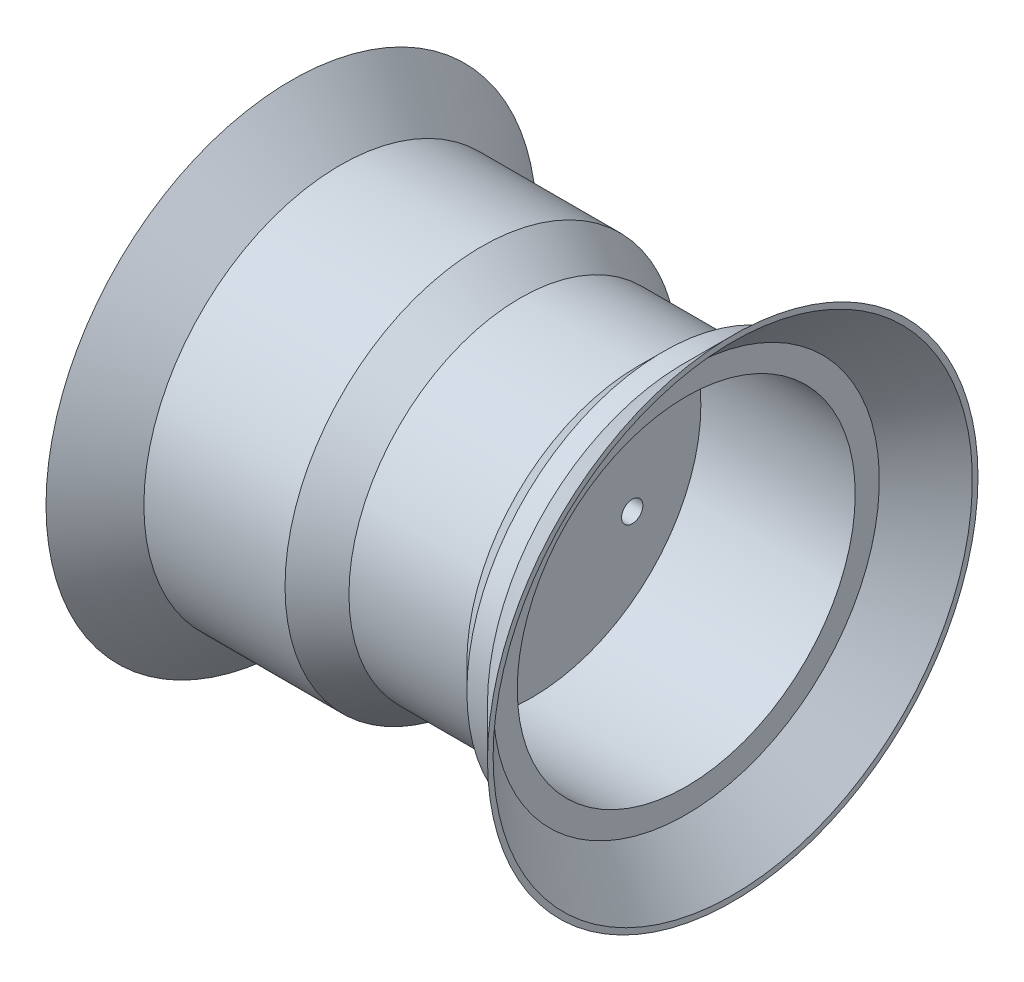
ISO-10303-21;
HEADER;
FILE_DESCRIPTION(('STEP AP214'),'2;1');
FILE_NAME('part.step','',(''),(''),'','','');
FILE_SCHEMA(('AUTOMOTIVE_DESIGN { 1 0 10303 214 1 1 1 1 }'));
ENDSEC;
DATA;
#1=APPLICATION_CONTEXT('core data for automotive mechanical design processes');
#2=APPLICATION_PROTOCOL_DEFINITION('international standard','automotive_design',2000,#1);
#3=PRODUCT_CONTEXT('',#1,'mechanical');
#4=PRODUCT('Part','Part','',(#3));
#5=PRODUCT_RELATED_PRODUCT_CATEGORY('part','',(#4));
#6=PRODUCT_DEFINITION_FORMATION('','',#4);
#7=PRODUCT_DEFINITION_CONTEXT('part definition',#1,'design');
#8=PRODUCT_DEFINITION('design','',#6,#7);
#9=PRODUCT_DEFINITION_SHAPE('','',#8);
#10=(LENGTH_UNIT() NAMED_UNIT(*) SI_UNIT(.MILLI.,.METRE.));
#11=(NAMED_UNIT(*) PLANE_ANGLE_UNIT() SI_UNIT($,.RADIAN.));
#12=(NAMED_UNIT(*) SI_UNIT($,.STERADIAN.) SOLID_ANGLE_UNIT());
#13=UNCERTAINTY_MEASURE_WITH_UNIT(LENGTH_MEASURE(1.E-05),#10,'distance_accuracy_value','');
#14=(GEOMETRIC_REPRESENTATION_CONTEXT(3) GLOBAL_UNCERTAINTY_ASSIGNED_CONTEXT((#13)) GLOBAL_UNIT_ASSIGNED_CONTEXT((#10,
#11,#12)) REPRESENTATION_CONTEXT('',''));
#15=CARTESIAN_POINT('',(0.,0.,0.));
#16=DIRECTION('',(0.,0.,1.));
#17=DIRECTION('',(1.,0.,0.));
#18=AXIS2_PLACEMENT_3D('',#15,#16,#17);
#19=CARTESIAN_POINT('',(48.,0.,0.));
#20=DIRECTION('',(-1.,0.,0.));
#21=DIRECTION('',(0.,0.,1.));
#22=AXIS2_PLACEMENT_3D('',#19,#20,#21);
#23=PLANE('',#22);
#24=CARTESIAN_POINT('',(48.,0.,0.));
#25=DIRECTION('',(-1.,0.,0.));
#26=DIRECTION('',(0.,0.,1.));
#27=AXIS2_PLACEMENT_3D('',#24,#25,#26);
#28=CIRCLE('',#27,50.);
#29=CARTESIAN_POINT('',(48.,0.,50.));
#30=VERTEX_POINT('',#29);
#31=EDGE_CURVE('E93',#30,#30,#28,.T.);
#32=ORIENTED_EDGE('',*,*,#31,.T.);
#33=EDGE_LOOP('',(#32));
#34=FACE_BOUND('',#33,.T.);
#35=CARTESIAN_POINT('',(48.,0.,0.));
#36=DIRECTION('',(-1.,0.,0.));
#37=DIRECTION('',(0.,0.,1.));
#38=AXIS2_PLACEMENT_3D('',#35,#36,#37);
#39=CIRCLE('',#38,48.9241631281988);
#40=CARTESIAN_POINT('',(48.,0.,48.9241631281988));
#41=VERTEX_POINT('',#40);
#42=EDGE_CURVE('E57',#41,#41,#39,.F.);
#43=ORIENTED_EDGE('',*,*,#42,.T.);
#44=EDGE_LOOP('',(#43));
#45=FACE_BOUND('',#44,.T.);
#46=ADVANCED_FACE('F31',(#34,#45),#23,.T.);
#47=CARTESIAN_POINT('',(0.,0.,0.));
#48=DIRECTION('',(1.,0.,0.));
#49=DIRECTION('',(0.,0.,-1.));
#50=AXIS2_PLACEMENT_3D('',#47,#48,#49);
#51=PLANE('',#50);
#52=CARTESIAN_POINT('',(0.,0.,0.));
#53=DIRECTION('',(1.,0.,0.));
#54=DIRECTION('',(0.,0.,-1.));
#55=AXIS2_PLACEMENT_3D('',#52,#53,#54);
#56=CIRCLE('',#55,62.041253289042);
#57=CARTESIAN_POINT('',(0.,0.,-62.041253289042));
#58=VERTEX_POINT('',#57);
#59=EDGE_CURVE('E51',#58,#58,#56,.F.);
#60=ORIENTED_EDGE('',*,*,#59,.F.);
#61=EDGE_LOOP('',(#60));
#62=FACE_BOUND('',#61,.T.);
#63=CARTESIAN_POINT('',(0.,0.,0.));
#64=DIRECTION('',(-1.,0.,0.));
#65=DIRECTION('',(0.,0.,1.));
#66=AXIS2_PLACEMENT_3D('',#63,#64,#65);
#67=CIRCLE('',#66,63.5);
#68=CARTESIAN_POINT('',(0.,0.,63.5));
#69=VERTEX_POINT('',#68);
#70=EDGE_CURVE('E10',#69,#69,#67,.T.);
#71=ORIENTED_EDGE('',*,*,#70,.T.);
#72=EDGE_LOOP('',(#71));
#73=FACE_BOUND('',#72,.T.);
#74=ADVANCED_FACE('F33',(#62,#73),#51,.F.);
#75=CARTESIAN_POINT('',(12.6713535188629,0.,0.));
#76=DIRECTION('',(-1.,0.,0.));
#77=DIRECTION('',(0.,0.,1.));
#78=AXIS2_PLACEMENT_3D('',#75,#76,#77);
#79=CONICAL_SURFACE('',#78,50.8286464811371,0.785398163397449);
#80=ORIENTED_EDGE('',*,*,#70,.F.);
#81=EDGE_LOOP('',(#80));
#82=FACE_BOUND('',#81,.T.);
#83=CARTESIAN_POINT('',(12.6713535188629,0.,0.));
#84=DIRECTION('',(-1.,0.,0.));
#85=DIRECTION('',(0.,0.,1.));
#86=AXIS2_PLACEMENT_3D('',#83,#84,#85);
#87=CIRCLE('',#86,50.8286464811371);
#88=CARTESIAN_POINT('',(12.6713535188629,0.,50.8286464811371));
#89=VERTEX_POINT('',#88);
#90=EDGE_CURVE('E39',#89,#89,#87,.T.);
#91=ORIENTED_EDGE('',*,*,#90,.T.);
#92=EDGE_LOOP('',(#91));
#93=FACE_BOUND('',#92,.T.);
#94=ADVANCED_FACE('F164',(#82,#93),#79,.T.);
#95=CARTESIAN_POINT('',(0.,0.,0.));
#96=DIRECTION('',(-1.,0.,0.));
#97=DIRECTION('',(0.,0.,1.));
#98=AXIS2_PLACEMENT_3D('',#95,#96,#97);
#99=CYLINDRICAL_SURFACE('',#98,50.8286464811371);
#100=ORIENTED_EDGE('',*,*,#90,.F.);
#101=EDGE_LOOP('',(#100));
#102=FACE_BOUND('',#101,.T.);
#103=CARTESIAN_POINT('',(49.2145860056369,0.,0.));
#104=DIRECTION('',(-1.,0.,0.));
#105=DIRECTION('',(0.,0.,1.));
#106=AXIS2_PLACEMENT_3D('',#103,#104,#105);
#107=CIRCLE('',#106,50.8286464811371);
#108=CARTESIAN_POINT('',(49.2145860056369,0.,50.8286464811371));
#109=VERTEX_POINT('',#108);
#110=EDGE_CURVE('E44',#109,#109,#107,.T.);
#111=ORIENTED_EDGE('',*,*,#110,.T.);
#112=EDGE_LOOP('',(#111));
#113=FACE_BOUND('',#112,.T.);
#114=ADVANCED_FACE('F113',(#102,#113),#99,.T.);
#115=CARTESIAN_POINT('',(59.2702116618242,0.,0.));
#116=DIRECTION('',(-1.,0.,0.));
#117=DIRECTION('',(0.,0.,1.));
#118=AXIS2_PLACEMENT_3D('',#115,#116,#117);
#119=CONICAL_SURFACE('',#118,44.337039427469,0.573254453729873);
#120=ORIENTED_EDGE('',*,*,#110,.F.);
#121=EDGE_LOOP('',(#120));
#122=FACE_BOUND('',#121,.T.);
#123=CARTESIAN_POINT('',(59.2702116618242,0.,0.));
#124=DIRECTION('',(-1.,0.,0.));
#125=DIRECTION('',(0.,0.,1.));
#126=AXIS2_PLACEMENT_3D('',#123,#124,#125);
#127=CIRCLE('',#126,44.337039427469);
#128=CARTESIAN_POINT('',(59.2702116618242,0.,44.337039427469));
#129=VERTEX_POINT('',#128);
#130=EDGE_CURVE('E108',#129,#129,#127,.T.);
#131=ORIENTED_EDGE('',*,*,#130,.T.);
#132=EDGE_LOOP('',(#131));
#133=FACE_BOUND('',#132,.T.);
#134=ADVANCED_FACE('F115',(#122,#133),#119,.T.);
#135=CARTESIAN_POINT('',(0.,0.,0.));
#136=DIRECTION('',(-1.,0.,0.));
#137=DIRECTION('',(0.,0.,1.));
#138=AXIS2_PLACEMENT_3D('',#135,#136,#137);
#139=CYLINDRICAL_SURFACE('',#138,44.337039427469);
#140=ORIENTED_EDGE('',*,*,#130,.F.);
#141=EDGE_LOOP('',(#140));
#142=FACE_BOUND('',#141,.T.);
#143=CARTESIAN_POINT('',(89.8029204149404,0.,0.));
#144=DIRECTION('',(-1.,0.,0.));
#145=DIRECTION('',(0.,0.,1.));
#146=AXIS2_PLACEMENT_3D('',#143,#144,#145);
#147=CIRCLE('',#146,44.337039427469);
#148=CARTESIAN_POINT('',(89.8029204149404,0.,44.337039427469));
#149=VERTEX_POINT('',#148);
#150=EDGE_CURVE('E105',#149,#149,#147,.T.);
#151=ORIENTED_EDGE('',*,*,#150,.T.);
#152=EDGE_LOOP('',(#151));
#153=FACE_BOUND('',#152,.T.);
#154=ADVANCED_FACE('F118',(#142,#153),#139,.T.);
#155=CARTESIAN_POINT('',(96.2945274686083,0.,0.));
#156=DIRECTION('',(1.,0.,0.));
#157=DIRECTION('',(0.,0.,-1.));
#158=AXIS2_PLACEMENT_3D('',#155,#156,#157);
#159=CONICAL_SURFACE('',#158,50.8286464811371,0.785398163397461);
#160=ORIENTED_EDGE('',*,*,#150,.F.);
#161=EDGE_LOOP('',(#160));
#162=FACE_BOUND('',#161,.T.);
#163=CARTESIAN_POINT('',(96.2945274686083,0.,0.));
#164=DIRECTION('',(-1.,0.,0.));
#165=DIRECTION('',(0.,0.,1.));
#166=AXIS2_PLACEMENT_3D('',#163,#164,#165);
#167=CIRCLE('',#166,50.8286464811371);
#168=CARTESIAN_POINT('',(96.2945274686083,0.,50.8286464811371));
#169=VERTEX_POINT('',#168);
#170=EDGE_CURVE('E102',#169,#169,#167,.T.);
#171=ORIENTED_EDGE('',*,*,#170,.T.);
#172=EDGE_LOOP('',(#171));
#173=FACE_BOUND('',#172,.T.);
#174=ADVANCED_FACE('F124',(#162,#173),#159,.T.);
#175=CARTESIAN_POINT('',(0.,0.,0.));
#176=DIRECTION('',(-1.,0.,0.));
#177=DIRECTION('',(0.,0.,1.));
#178=AXIS2_PLACEMENT_3D('',#175,#176,#177);
#179=CYLINDRICAL_SURFACE('',#178,50.8286464811371);
#180=ORIENTED_EDGE('',*,*,#170,.F.);
#181=EDGE_LOOP('',(#180));
#182=FACE_BOUND('',#181,.T.);
#183=CARTESIAN_POINT('',(101.628646481137,0.,0.));
#184=DIRECTION('',(-1.,0.,0.));
#185=DIRECTION('',(0.,0.,1.));
#186=AXIS2_PLACEMENT_3D('',#183,#184,#185);
#187=CIRCLE('',#186,50.8286464811371);
#188=CARTESIAN_POINT('',(101.628646481137,0.,50.8286464811371));
#189=VERTEX_POINT('',#188);
#190=EDGE_CURVE('E99',#189,#189,#187,.T.);
#191=ORIENTED_EDGE('',*,*,#190,.T.);
#192=EDGE_LOOP('',(#191));
#193=FACE_BOUND('',#192,.T.);
#194=ADVANCED_FACE('F130',(#182,#193),#179,.T.);
#195=CARTESIAN_POINT('',(114.3,0.,0.));
#196=DIRECTION('',(1.,0.,0.));
#197=DIRECTION('',(0.,0.,-1.));
#198=AXIS2_PLACEMENT_3D('',#195,#196,#197);
#199=CONICAL_SURFACE('',#198,63.5,0.785398163397448);
#200=ORIENTED_EDGE('',*,*,#190,.F.);
#201=EDGE_LOOP('',(#200));
#202=FACE_BOUND('',#201,.T.);
#203=CARTESIAN_POINT('',(114.3,0.,0.));
#204=DIRECTION('',(-1.,0.,0.));
#205=DIRECTION('',(0.,0.,1.));
#206=AXIS2_PLACEMENT_3D('',#203,#204,#205);
#207=CIRCLE('',#206,63.5);
#208=CARTESIAN_POINT('',(114.3,0.,63.5));
#209=VERTEX_POINT('',#208);
#210=EDGE_CURVE('E96',#209,#209,#207,.T.);
#211=ORIENTED_EDGE('',*,*,#210,.T.);
#212=EDGE_LOOP('',(#211));
#213=FACE_BOUND('',#212,.T.);
#214=ADVANCED_FACE('F136',(#202,#213),#199,.T.);
#215=CARTESIAN_POINT('',(114.3,63.5,0.));
#216=DIRECTION('',(-1.,0.,0.));
#217=DIRECTION('',(0.,0.,1.));
#218=AXIS2_PLACEMENT_3D('',#215,#216,#217);
#219=PLANE('',#218);
#220=CARTESIAN_POINT('',(114.3,0.,0.));
#221=DIRECTION('',(-1.,0.,0.));
#222=DIRECTION('',(0.,0.,1.));
#223=AXIS2_PLACEMENT_3D('',#220,#221,#222);
#224=CIRCLE('',#223,62.041253289042);
#225=CARTESIAN_POINT('',(114.3,0.,62.041253289042));
#226=VERTEX_POINT('',#225);
#227=EDGE_CURVE('E53',#226,#226,#224,.F.);
#228=ORIENTED_EDGE('',*,*,#227,.F.);
#229=EDGE_LOOP('',(#228));
#230=FACE_BOUND('',#229,.T.);
#231=ORIENTED_EDGE('',*,*,#210,.F.);
#232=EDGE_LOOP('',(#231));
#233=FACE_BOUND('',#232,.T.);
#234=ADVANCED_FACE('F142',(#230,#233),#219,.F.);
#235=CARTESIAN_POINT('',(114.577777226452,0.,0.));
#236=DIRECTION('',(1.,0.,0.));
#237=DIRECTION('',(0.,0.,-1.));
#238=AXIS2_PLACEMENT_3D('',#235,#236,#237);
#239=CONICAL_SURFACE('',#238,62.3190305154939,0.785398163397442);
#240=CARTESIAN_POINT('',(102.258746710958,0.,0.));
#241=DIRECTION('',(-1.,0.,0.));
#242=DIRECTION('',(0.,0.,1.));
#243=AXIS2_PLACEMENT_3D('',#240,#241,#242);
#244=CIRCLE('',#243,50.);
#245=CARTESIAN_POINT('',(102.258746710958,0.,50.));
#246=VERTEX_POINT('',#245);
#247=EDGE_CURVE('E60',#246,#246,#244,.T.);
#248=ORIENTED_EDGE('',*,*,#247,.T.);
#249=EDGE_LOOP('',(#248));
#250=FACE_BOUND('',#249,.T.);
#251=ORIENTED_EDGE('',*,*,#227,.T.);
#252=EDGE_LOOP('',(#251));
#253=FACE_BOUND('',#252,.T.);
#254=ADVANCED_FACE('F147',(#250,#253),#239,.F.);
#255=CARTESIAN_POINT('',(102.258746710958,50.,0.));
#256=DIRECTION('',(1.,0.,0.));
#257=DIRECTION('',(0.,0.,-1.));
#258=AXIS2_PLACEMENT_3D('',#255,#256,#257);
#259=PLANE('',#258);
#260=ORIENTED_EDGE('',*,*,#247,.F.);
#261=EDGE_LOOP('',(#260));
#262=FACE_BOUND('',#261,.T.);
#263=CARTESIAN_POINT('',(102.258746710958,0.,0.));
#264=DIRECTION('',(1.,0.,0.));
#265=DIRECTION('',(0.,0.,-1.));
#266=AXIS2_PLACEMENT_3D('',#263,#264,#265);
#267=CIRCLE('',#266,43.75);
#268=CARTESIAN_POINT('',(102.258746710958,0.,-43.75));
#269=VERTEX_POINT('',#268);
#270=EDGE_CURVE('E48',#269,#269,#267,.F.);
#271=ORIENTED_EDGE('',*,*,#270,.T.);
#272=EDGE_LOOP('',(#271));
#273=FACE_BOUND('',#272,.T.);
#274=ADVANCED_FACE('F153',(#262,#273),#259,.T.);
#275=CARTESIAN_POINT('',(12.0412532890421,0.,0.));
#276=DIRECTION('',(-1.,0.,0.));
#277=DIRECTION('',(0.,0.,1.));
#278=AXIS2_PLACEMENT_3D('',#275,#276,#277);
#279=CONICAL_SURFACE('',#278,50.,0.785398163397443);
#280=CARTESIAN_POINT('',(12.0412532890421,0.,0.));
#281=DIRECTION('',(-1.,0.,0.));
#282=DIRECTION('',(0.,0.,1.));
#283=AXIS2_PLACEMENT_3D('',#280,#281,#282);
#284=CIRCLE('',#283,50.);
#285=CARTESIAN_POINT('',(12.0412532890421,0.,50.));
#286=VERTEX_POINT('',#285);
#287=EDGE_CURVE('E52',#286,#286,#284,.T.);
#288=ORIENTED_EDGE('',*,*,#287,.F.);
#289=EDGE_LOOP('',(#288));
#290=FACE_BOUND('',#289,.T.);
#291=ORIENTED_EDGE('',*,*,#59,.T.);
#292=EDGE_LOOP('',(#291));
#293=FACE_BOUND('',#292,.T.);
#294=ADVANCED_FACE('F187',(#290,#293),#279,.F.);
#295=CARTESIAN_POINT('',(62.3,0.,0.));
#296=DIRECTION('',(1.,0.,0.));
#297=DIRECTION('',(0.,0.,-1.));
#298=AXIS2_PLACEMENT_3D('',#295,#296,#297);
#299=PLANE('',#298);
#300=CARTESIAN_POINT('',(62.3,0.,0.));
#301=DIRECTION('',(1.,0.,0.));
#302=DIRECTION('',(0.,0.,-1.));
#303=AXIS2_PLACEMENT_3D('',#300,#301,#302);
#304=CIRCLE('',#303,11.625);
#305=CARTESIAN_POINT('',(62.3,0.,-11.625));
#306=VERTEX_POINT('',#305);
#307=EDGE_CURVE('E69',#306,#306,#304,.T.);
#308=ORIENTED_EDGE('',*,*,#307,.F.);
#309=EDGE_LOOP('',(#308));
#310=FACE_BOUND('',#309,.T.);
#311=CARTESIAN_POINT('',(62.3,-15.0000000000011,25.9807621135312));
#312=DIRECTION('',(1.,0.,0.));
#313=DIRECTION('',(0.,0.,-1.));
#314=AXIS2_PLACEMENT_3D('',#311,#312,#313);
#315=CIRCLE('',#314,2.75000000000243);
#316=CARTESIAN_POINT('',(62.3,-15.0000000000011,23.2307621135288));
#317=VERTEX_POINT('',#316);
#318=EDGE_CURVE('E232',#317,#317,#315,.T.);
#319=ORIENTED_EDGE('',*,*,#318,.F.);
#320=EDGE_LOOP('',(#319));
#321=FACE_BOUND('',#320,.T.);
#322=CARTESIAN_POINT('',(62.3,-14.9999999999989,-25.9807621135351));
#323=DIRECTION('',(1.,0.,0.));
#324=DIRECTION('',(0.,0.,-1.));
#325=AXIS2_PLACEMENT_3D('',#322,#323,#324);
#326=CIRCLE('',#325,2.75000000000166);
#327=CARTESIAN_POINT('',(62.3,-14.9999999999989,-28.7307621135367));
#328=VERTEX_POINT('',#327);
#329=EDGE_CURVE('E228',#328,#328,#326,.T.);
#330=ORIENTED_EDGE('',*,*,#329,.F.);
#331=EDGE_LOOP('',(#330));
#332=FACE_BOUND('',#331,.T.);
#333=CARTESIAN_POINT('',(62.3,30.,0.));
#334=DIRECTION('',(1.,0.,0.));
#335=DIRECTION('',(0.,0.,-1.));
#336=AXIS2_PLACEMENT_3D('',#333,#334,#335);
#337=CIRCLE('',#336,2.75);
#338=CARTESIAN_POINT('',(62.3,30.,-2.75));
#339=VERTEX_POINT('',#338);
#340=EDGE_CURVE('E226',#339,#339,#337,.T.);
#341=ORIENTED_EDGE('',*,*,#340,.F.);
#342=EDGE_LOOP('',(#341));
#343=FACE_BOUND('',#342,.T.);
#344=CARTESIAN_POINT('',(62.3,0.,0.));
#345=DIRECTION('',(1.,0.,0.));
#346=DIRECTION('',(0.,0.,-1.));
#347=AXIS2_PLACEMENT_3D('',#344,#345,#346);
#348=CIRCLE('',#347,43.75);
#349=CARTESIAN_POINT('',(62.3,0.,-43.75));
#350=VERTEX_POINT('',#349);
#351=EDGE_CURVE('E56',#350,#350,#348,.T.);
#352=ORIENTED_EDGE('',*,*,#351,.T.);
#353=EDGE_LOOP('',(#352));
#354=FACE_BOUND('',#353,.T.);
#355=ADVANCED_FACE('F181',(#310,#321,#332,#343,#354),#299,.T.);
#356=CARTESIAN_POINT('',(62.3,0.,0.));
#357=DIRECTION('',(1.,0.,0.));
#358=DIRECTION('',(0.,0.,-1.));
#359=AXIS2_PLACEMENT_3D('',#356,#357,#358);
#360=CYLINDRICAL_SURFACE('',#359,43.75);
#361=CARTESIAN_POINT('',(62.3,0.,-43.75));
#362=CARTESIAN_POINT('',(62.7162369449058,0.,-43.75));
#363=CARTESIAN_POINT('',(63.1324738898116,0.,-43.75));
#364=CARTESIAN_POINT('',(63.9649477796232,0.,-43.75));
#365=CARTESIAN_POINT('',(64.381184724529,0.,-43.75));
#366=CARTESIAN_POINT('',(65.2136586143407,0.,-43.75));
#367=CARTESIAN_POINT('',(65.6298955592465,0.,-43.75));
#368=CARTESIAN_POINT('',(66.4623694490581,0.,-43.75));
#369=CARTESIAN_POINT('',(66.8786063939639,0.,-43.75));
#370=CARTESIAN_POINT('',(67.7110802837755,0.,-43.75));
#371=CARTESIAN_POINT('',(68.1273172286813,0.,-43.75));
#372=CARTESIAN_POINT('',(68.959791118493,0.,-43.75));
#373=CARTESIAN_POINT('',(69.3760280633988,0.,-43.75));
#374=CARTESIAN_POINT('',(70.2085019532104,0.,-43.75));
#375=CARTESIAN_POINT('',(70.6247388981162,0.,-43.75));
#376=CARTESIAN_POINT('',(71.4572127879278,0.,-43.75));
#377=CARTESIAN_POINT('',(71.8734497328336,0.,-43.75));
#378=CARTESIAN_POINT('',(72.7059236226453,0.,-43.75));
#379=CARTESIAN_POINT('',(73.1221605675511,0.,-43.75));
#380=CARTESIAN_POINT('',(73.9546344573627,0.,-43.75));
#381=CARTESIAN_POINT('',(74.3708714022685,0.,-43.75));
#382=CARTESIAN_POINT('',(75.2033452920801,0.,-43.75));
#383=CARTESIAN_POINT('',(75.6195822369859,0.,-43.75));
#384=CARTESIAN_POINT('',(76.4520561267976,0.,-43.75));
#385=CARTESIAN_POINT('',(76.8682930717034,0.,-43.75));
#386=CARTESIAN_POINT('',(77.700766961515,0.,-43.75));
#387=CARTESIAN_POINT('',(78.1170039064208,0.,-43.75));
#388=CARTESIAN_POINT('',(78.9494777962324,0.,-43.75));
#389=CARTESIAN_POINT('',(79.3657147411382,0.,-43.75));
#390=CARTESIAN_POINT('',(80.1981886309499,0.,-43.75));
#391=CARTESIAN_POINT('',(80.6144255758557,0.,-43.75));
#392=CARTESIAN_POINT('',(81.4468994656673,0.,-43.75));
#393=CARTESIAN_POINT('',(81.8631364105731,0.,-43.75));
#394=CARTESIAN_POINT('',(82.6956103003847,0.,-43.75));
#395=CARTESIAN_POINT('',(83.1118472452905,0.,-43.75));
#396=CARTESIAN_POINT('',(83.9443211351022,0.,-43.75));
#397=CARTESIAN_POINT('',(84.360558080008,0.,-43.75));
#398=CARTESIAN_POINT('',(85.1930319698196,0.,-43.75));
#399=CARTESIAN_POINT('',(85.6092689147254,0.,-43.75));
#400=CARTESIAN_POINT('',(86.441742804537,0.,-43.75));
#401=CARTESIAN_POINT('',(86.8579797494429,0.,-43.75));
#402=CARTESIAN_POINT('',(87.6904536392545,0.,-43.75));
#403=CARTESIAN_POINT('',(88.1066905841603,0.,-43.75));
#404=CARTESIAN_POINT('',(88.9391644739719,0.,-43.75));
#405=CARTESIAN_POINT('',(89.3554014188777,0.,-43.75));
#406=CARTESIAN_POINT('',(90.1878753086893,0.,-43.75));
#407=CARTESIAN_POINT('',(90.6041122535952,0.,-43.75));
#408=CARTESIAN_POINT('',(91.4365861434068,0.,-43.75));
#409=CARTESIAN_POINT('',(91.8528230883126,0.,-43.75));
#410=CARTESIAN_POINT('',(92.6852969781242,0.,-43.75));
#411=CARTESIAN_POINT('',(93.10153392303,0.,-43.75));
#412=CARTESIAN_POINT('',(93.9340078128416,0.,-43.75));
#413=CARTESIAN_POINT('',(94.3502447577474,0.,-43.75));
#414=CARTESIAN_POINT('',(95.1827186475591,0.,-43.75));
#415=CARTESIAN_POINT('',(95.5989555924649,0.,-43.75));
#416=CARTESIAN_POINT('',(96.4314294822765,0.,-43.75));
#417=CARTESIAN_POINT('',(96.8476664271823,0.,-43.75));
#418=CARTESIAN_POINT('',(97.6801403169939,0.,-43.75));
#419=CARTESIAN_POINT('',(98.0963772618997,0.,-43.75));
#420=CARTESIAN_POINT('',(98.9288511517114,0.,-43.75));
#421=CARTESIAN_POINT('',(99.3450880966172,0.,-43.75));
#422=CARTESIAN_POINT('',(100.177561986429,0.,-43.75));
#423=CARTESIAN_POINT('',(100.593798931335,0.,-43.75));
#424=CARTESIAN_POINT('',(101.426272821146,0.,-43.75));
#425=CARTESIAN_POINT('',(101.842509766052,0.,-43.75));
#426=CARTESIAN_POINT('',(102.258746710958,0.,-43.75));
#427=B_SPLINE_CURVE_WITH_KNOTS('',3,(#361,#362,#363,#364,#365,#366,#367,#368,#369,#370,#371,
#372,#373,#374,#375,#376,#377,#378,#379,#380,#381,#382,#383,#384,#385,#386,#387,#388,#389,#390,
#391,#392,#393,#394,#395,#396,#397,#398,#399,#400,#401,#402,#403,#404,#405,#406,#407,#408,#409,
#410,#411,#412,#413,#414,#415,#416,#417,#418,#419,#420,#421,#422,#423,#424,#425,#426),
.UNSPECIFIED.,.F.,.F.,(4,2,2,2,2,2,2,2,2,2,2,2,2,2,2,2,2,2,2,2,2,2,2,2,2,2,2,2,2,2,2,2,4),(0.,
1.24871083471744,2.49742166943488,3.74613250415231,4.99484333886974,6.24355417358718,
7.49226500830461,8.74097584302205,9.98968667773948,11.2383975124569,12.4871083471743,
13.7358191818918,14.9845300166092,16.2332408513267,17.4819516860441,18.7306625207615,
19.979373355479,21.2280841901964,22.4767950249138,23.7255058596313,24.9742166943487,
26.2229275290661,27.4716383637836,28.720349198501,29.9690600332184,31.2177708679359,
32.4664817026533,33.7151925373707,34.9639033720881,36.2126142068056,37.461325041523,
38.7100358762405,39.9587467109579),.UNSPECIFIED.);
#428=EDGE_CURVE('BSEAM168',#350,#269,#427,.T.);
#429=ORIENTED_EDGE('',*,*,#351,.F.);
#430=ORIENTED_EDGE('',*,*,#270,.F.);
#431=ORIENTED_EDGE('',*,*,#428,.T.);
#432=ORIENTED_EDGE('',*,*,#428,.F.);
#433=EDGE_LOOP('',(#429,#431,#430,#432));
#434=FACE_BOUND('',#433,.T.);
#435=ADVANCED_FACE('F168',(#434),#360,.F.);
#436=CARTESIAN_POINT('',(48.,0.,0.));
#437=DIRECTION('',(-1.,0.,0.));
#438=DIRECTION('',(0.,0.,1.));
#439=AXIS2_PLACEMENT_3D('',#436,#437,#438);
#440=CYLINDRICAL_SURFACE('',#439,50.);
#441=ORIENTED_EDGE('',*,*,#31,.F.);
#442=EDGE_LOOP('',(#441));
#443=FACE_BOUND('',#442,.T.);
#444=ORIENTED_EDGE('',*,*,#287,.T.);
#445=EDGE_LOOP('',(#444));
#446=FACE_BOUND('',#445,.T.);
#447=ADVANCED_FACE('F170',(#443,#446),#440,.F.);
#448=CARTESIAN_POINT('',(55.7061930593051,0.,0.));
#449=DIRECTION('',(-1.,0.,0.));
#450=DIRECTION('',(0.,0.,1.));
#451=AXIS2_PLACEMENT_3D('',#448,#449,#450);
#452=CONICAL_SURFACE('',#451,41.7412972598519,0.750264187185052);
#453=CARTESIAN_POINT('',(53.5511408283355,0.,0.));
#454=DIRECTION('',(-1.,0.,0.));
#455=DIRECTION('',(0.,0.,1.));
#456=AXIS2_PLACEMENT_3D('',#453,#454,#455);
#457=CIRCLE('',#456,43.75);
#458=CARTESIAN_POINT('',(53.5511408283355,0.,43.75));
#459=VERTEX_POINT('',#458);
#460=EDGE_CURVE('E61',#459,#459,#457,.T.);
#461=ORIENTED_EDGE('',*,*,#460,.F.);
#462=EDGE_LOOP('',(#461));
#463=FACE_BOUND('',#462,.T.);
#464=ORIENTED_EDGE('',*,*,#42,.F.);
#465=EDGE_LOOP('',(#464));
#466=FACE_BOUND('',#465,.T.);
#467=ADVANCED_FACE('F172',(#463,#466),#452,.F.);
#468=CARTESIAN_POINT('',(58.,0.,0.));
#469=DIRECTION('',(-1.,0.,0.));
#470=DIRECTION('',(0.,0.,1.));
#471=AXIS2_PLACEMENT_3D('',#468,#469,#470);
#472=CYLINDRICAL_SURFACE('',#471,43.75);
#473=ORIENTED_EDGE('',*,*,#460,.T.);
#474=EDGE_LOOP('',(#473));
#475=FACE_BOUND('',#474,.T.);
#476=CARTESIAN_POINT('',(58.,0.,0.));
#477=DIRECTION('',(-1.,0.,0.));
#478=DIRECTION('',(0.,0.,1.));
#479=AXIS2_PLACEMENT_3D('',#476,#477,#478);
#480=CIRCLE('',#479,43.75);
#481=CARTESIAN_POINT('',(58.,0.,43.75));
#482=VERTEX_POINT('',#481);
#483=EDGE_CURVE('E64',#482,#482,#480,.T.);
#484=ORIENTED_EDGE('',*,*,#483,.F.);
#485=EDGE_LOOP('',(#484));
#486=FACE_BOUND('',#485,.T.);
#487=ADVANCED_FACE('F178',(#475,#486),#472,.F.);
#488=CARTESIAN_POINT('',(58.,0.,0.));
#489=DIRECTION('',(-1.,0.,0.));
#490=DIRECTION('',(0.,0.,1.));
#491=AXIS2_PLACEMENT_3D('',#488,#489,#490);
#492=PLANE('',#491);
#493=CARTESIAN_POINT('',(58.,-15.0000000000011,25.9807621135312));
#494=DIRECTION('',(-1.,0.,0.));
#495=DIRECTION('',(0.,0.,1.));
#496=AXIS2_PLACEMENT_3D('',#493,#494,#495);
#497=CIRCLE('',#496,2.75000000000243);
#498=CARTESIAN_POINT('',(58.,-15.0000000000011,28.7307621135337));
#499=VERTEX_POINT('',#498);
#500=EDGE_CURVE('E35',#499,#499,#497,.T.);
#501=ORIENTED_EDGE('',*,*,#500,.F.);
#502=EDGE_LOOP('',(#501));
#503=FACE_BOUND('',#502,.T.);
#504=CARTESIAN_POINT('',(58.,-14.9999999999989,-25.9807621135351));
#505=DIRECTION('',(-1.,0.,0.));
#506=DIRECTION('',(0.,0.,1.));
#507=AXIS2_PLACEMENT_3D('',#504,#505,#506);
#508=CIRCLE('',#507,2.75000000000166);
#509=CARTESIAN_POINT('',(58.,-14.9999999999989,-23.2307621135334));
#510=VERTEX_POINT('',#509);
#511=EDGE_CURVE('E71',#510,#510,#508,.T.);
#512=ORIENTED_EDGE('',*,*,#511,.F.);
#513=EDGE_LOOP('',(#512));
#514=FACE_BOUND('',#513,.T.);
#515=CARTESIAN_POINT('',(58.,30.,0.));
#516=DIRECTION('',(-1.,0.,0.));
#517=DIRECTION('',(0.,0.,1.));
#518=AXIS2_PLACEMENT_3D('',#515,#516,#517);
#519=CIRCLE('',#518,2.75);
#520=CARTESIAN_POINT('',(58.,30.,2.75));
#521=VERTEX_POINT('',#520);
#522=EDGE_CURVE('E68',#521,#521,#519,.T.);
#523=ORIENTED_EDGE('',*,*,#522,.F.);
#524=EDGE_LOOP('',(#523));
#525=FACE_BOUND('',#524,.T.);
#526=CARTESIAN_POINT('',(58.,0.,0.));
#527=DIRECTION('',(-1.,0.,0.));
#528=DIRECTION('',(0.,0.,1.));
#529=AXIS2_PLACEMENT_3D('',#526,#527,#528);
#530=CIRCLE('',#529,11.625);
#531=CARTESIAN_POINT('',(58.,0.,11.625));
#532=VERTEX_POINT('',#531);
#533=EDGE_CURVE('E65',#532,#532,#530,.T.);
#534=ORIENTED_EDGE('',*,*,#533,.F.);
#535=EDGE_LOOP('',(#534));
#536=FACE_BOUND('',#535,.T.);
#537=ORIENTED_EDGE('',*,*,#483,.T.);
#538=EDGE_LOOP('',(#537));
#539=FACE_BOUND('',#538,.T.);
#540=ADVANCED_FACE('F202',(#503,#514,#525,#536,#539),#492,.T.);
#541=CARTESIAN_POINT('',(52.3,0.,0.));
#542=DIRECTION('',(1.,0.,0.));
#543=DIRECTION('',(0.,0.,-1.));
#544=AXIS2_PLACEMENT_3D('',#541,#542,#543);
#545=CYLINDRICAL_SURFACE('',#544,11.625);
#546=ORIENTED_EDGE('',*,*,#533,.T.);
#547=EDGE_LOOP('',(#546));
#548=FACE_BOUND('',#547,.T.);
#549=ORIENTED_EDGE('',*,*,#307,.T.);
#550=EDGE_LOOP('',(#549));
#551=FACE_BOUND('',#550,.T.);
#552=ADVANCED_FACE('F206',(#548,#551),#545,.F.);
#553=CARTESIAN_POINT('',(52.3,30.,0.));
#554=DIRECTION('',(1.,0.,0.));
#555=DIRECTION('',(0.,0.,-1.));
#556=AXIS2_PLACEMENT_3D('',#553,#554,#555);
#557=CYLINDRICAL_SURFACE('',#556,2.75);
#558=ORIENTED_EDGE('',*,*,#522,.T.);
#559=EDGE_LOOP('',(#558));
#560=FACE_BOUND('',#559,.T.);
#561=ORIENTED_EDGE('',*,*,#340,.T.);
#562=EDGE_LOOP('',(#561));
#563=FACE_BOUND('',#562,.T.);
#564=ADVANCED_FACE('F210',(#560,#563),#557,.F.);
#565=CARTESIAN_POINT('',(52.3,-14.9999999999989,-25.9807621135351));
#566=DIRECTION('',(1.,0.,0.));
#567=DIRECTION('',(0.,0.,-1.));
#568=AXIS2_PLACEMENT_3D('',#565,#566,#567);
#569=CYLINDRICAL_SURFACE('',#568,2.75000000000166);
#570=ORIENTED_EDGE('',*,*,#511,.T.);
#571=EDGE_LOOP('',(#570));
#572=FACE_BOUND('',#571,.T.);
#573=ORIENTED_EDGE('',*,*,#329,.T.);
#574=EDGE_LOOP('',(#573));
#575=FACE_BOUND('',#574,.T.);
#576=ADVANCED_FACE('F215',(#572,#575),#569,.F.);
#577=CARTESIAN_POINT('',(52.3,-15.0000000000011,25.9807621135312));
#578=DIRECTION('',(1.,0.,0.));
#579=DIRECTION('',(0.,0.,-1.));
#580=AXIS2_PLACEMENT_3D('',#577,#578,#579);
#581=CYLINDRICAL_SURFACE('',#580,2.75000000000243);
#582=ORIENTED_EDGE('',*,*,#500,.T.);
#583=EDGE_LOOP('',(#582));
#584=FACE_BOUND('',#583,.T.);
#585=ORIENTED_EDGE('',*,*,#318,.T.);
#586=EDGE_LOOP('',(#585));
#587=FACE_BOUND('',#586,.T.);
#588=ADVANCED_FACE('F212',(#584,#587),#581,.F.);
#589=CLOSED_SHELL('',(#46,#74,#94,#114,#134,#154,#174,#194,#214,#234,#254,#274,#294,#355,#435,
#447,#467,#487,#540,#552,#564,#576,#588));
#590=MANIFOLD_SOLID_BREP('B2',#589);
#591=ADVANCED_BREP_SHAPE_REPRESENTATION('',(#18,#590),#14);
#592=SHAPE_DEFINITION_REPRESENTATION(#9,#591);
ENDSEC;
END-ISO-10303-21;
